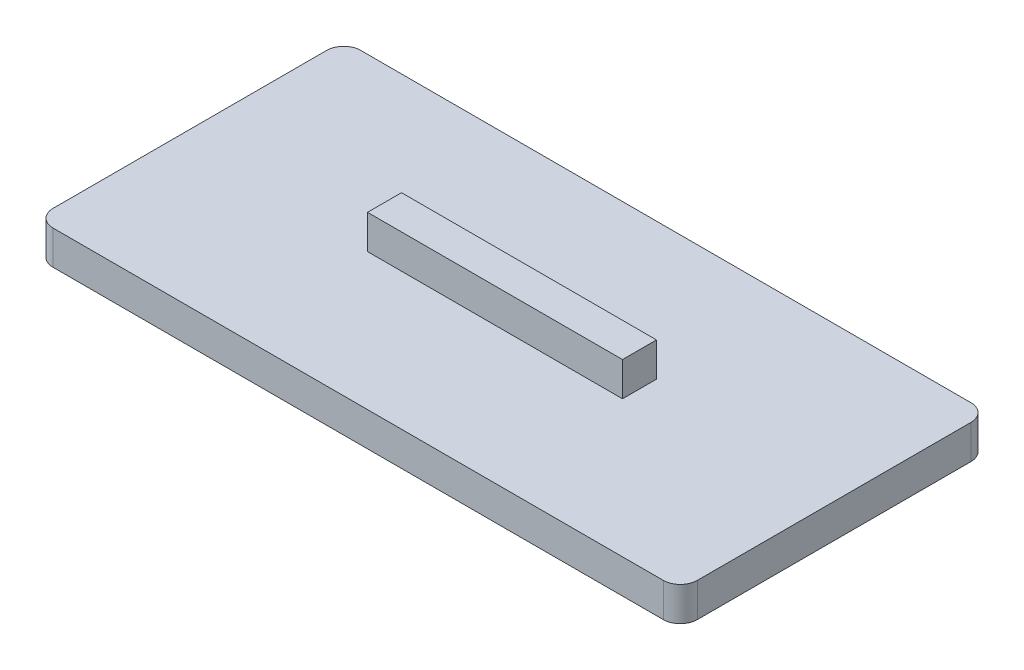
ISO-10303-21;
HEADER;
FILE_DESCRIPTION(('STEP AP214'),'2;1');
FILE_NAME('part.step','',(''),(''),'','','');
FILE_SCHEMA(('AUTOMOTIVE_DESIGN { 1 0 10303 214 1 1 1 1 }'));
ENDSEC;
DATA;
#1=APPLICATION_CONTEXT('core data for automotive mechanical design processes');
#2=APPLICATION_PROTOCOL_DEFINITION('international standard','automotive_design',2000,#1);
#3=PRODUCT_CONTEXT('',#1,'mechanical');
#4=PRODUCT('Part','Part','',(#3));
#5=PRODUCT_RELATED_PRODUCT_CATEGORY('part','',(#4));
#6=PRODUCT_DEFINITION_FORMATION('','',#4);
#7=PRODUCT_DEFINITION_CONTEXT('part definition',#1,'design');
#8=PRODUCT_DEFINITION('design','',#6,#7);
#9=PRODUCT_DEFINITION_SHAPE('','',#8);
#10=(LENGTH_UNIT() NAMED_UNIT(*) SI_UNIT(.MILLI.,.METRE.));
#11=(NAMED_UNIT(*) PLANE_ANGLE_UNIT() SI_UNIT($,.RADIAN.));
#12=(NAMED_UNIT(*) SI_UNIT($,.STERADIAN.) SOLID_ANGLE_UNIT());
#13=UNCERTAINTY_MEASURE_WITH_UNIT(LENGTH_MEASURE(1.E-05),#10,'distance_accuracy_value','');
#14=(GEOMETRIC_REPRESENTATION_CONTEXT(3) GLOBAL_UNCERTAINTY_ASSIGNED_CONTEXT((#13)) GLOBAL_UNIT_ASSIGNED_CONTEXT((#10,
#11,#12)) REPRESENTATION_CONTEXT('',''));
#15=CARTESIAN_POINT('',(0.,0.,0.));
#16=DIRECTION('',(0.,0.,1.));
#17=DIRECTION('',(1.,0.,0.));
#18=AXIS2_PLACEMENT_3D('',#15,#16,#17);
#19=CARTESIAN_POINT('',(-22.7965,0.,10.2235));
#20=DIRECTION('',(0.,-1.,0.));
#21=DIRECTION('',(0.,0.,-1.));
#22=AXIS2_PLACEMENT_3D('',#19,#20,#21);
#23=PLANE('',#22);
#24=CARTESIAN_POINT('',(-22.7965,0.,10.2235));
#25=DIRECTION('',(0.,1.,0.));
#26=DIRECTION('',(0.,0.,-1.));
#27=AXIS2_PLACEMENT_3D('',#24,#25,#26);
#28=CIRCLE('',#27,1.27);
#29=CARTESIAN_POINT('',(-24.0665,0.,10.2235));
#30=VERTEX_POINT('',#29);
#31=CARTESIAN_POINT('',(-22.7965,0.,11.4935));
#32=VERTEX_POINT('',#31);
#33=EDGE_CURVE('E162',#30,#32,#28,.T.);
#34=ORIENTED_EDGE('',*,*,#33,.T.);
#35=DIRECTION('',(1.,0.,0.));
#36=VECTOR('',#35,1.);
#37=CARTESIAN_POINT('',(-22.7965,0.,11.4935));
#38=LINE('',#37,#36);
#39=CARTESIAN_POINT('',(22.7965,0.,11.4935));
#40=VERTEX_POINT('',#39);
#41=EDGE_CURVE('E166',#32,#40,#38,.T.);
#42=ORIENTED_EDGE('',*,*,#41,.T.);
#43=CARTESIAN_POINT('',(22.7965,0.,10.2235));
#44=DIRECTION('',(0.,1.,0.));
#45=DIRECTION('',(0.,0.,1.));
#46=AXIS2_PLACEMENT_3D('',#43,#44,#45);
#47=CIRCLE('',#46,1.27);
#48=CARTESIAN_POINT('',(24.0665,0.,10.2235));
#49=VERTEX_POINT('',#48);
#50=EDGE_CURVE('E170',#40,#49,#47,.T.);
#51=ORIENTED_EDGE('',*,*,#50,.T.);
#52=DIRECTION('',(0.,0.,-1.));
#53=VECTOR('',#52,1.);
#54=CARTESIAN_POINT('',(24.0665,0.,10.2235));
#55=LINE('',#54,#53);
#56=CARTESIAN_POINT('',(24.0665,0.,-10.2235));
#57=VERTEX_POINT('',#56);
#58=EDGE_CURVE('E174',#49,#57,#55,.T.);
#59=ORIENTED_EDGE('',*,*,#58,.T.);
#60=CARTESIAN_POINT('',(22.7965,0.,-10.2235));
#61=DIRECTION('',(0.,1.,0.));
#62=DIRECTION('',(0.,0.,-1.));
#63=AXIS2_PLACEMENT_3D('',#60,#61,#62);
#64=CIRCLE('',#63,1.27);
#65=CARTESIAN_POINT('',(22.7965,0.,-11.4935));
#66=VERTEX_POINT('',#65);
#67=EDGE_CURVE('E178',#57,#66,#64,.T.);
#68=ORIENTED_EDGE('',*,*,#67,.T.);
#69=DIRECTION('',(-1.,0.,0.));
#70=VECTOR('',#69,1.);
#71=CARTESIAN_POINT('',(-22.7965,0.,-11.4935));
#72=LINE('',#71,#70);
#73=CARTESIAN_POINT('',(-22.7965,0.,-11.4935));
#74=VERTEX_POINT('',#73);
#75=EDGE_CURVE('E182',#66,#74,#72,.T.);
#76=ORIENTED_EDGE('',*,*,#75,.T.);
#77=CARTESIAN_POINT('',(-22.7965,0.,-10.2235));
#78=DIRECTION('',(0.,1.,0.));
#79=DIRECTION('',(0.,0.,-1.));
#80=AXIS2_PLACEMENT_3D('',#77,#78,#79);
#81=CIRCLE('',#80,1.27);
#82=CARTESIAN_POINT('',(-24.0665,0.,-10.2235));
#83=VERTEX_POINT('',#82);
#84=EDGE_CURVE('E134',#74,#83,#81,.T.);
#85=ORIENTED_EDGE('',*,*,#84,.T.);
#86=DIRECTION('',(0.,0.,1.));
#87=VECTOR('',#86,1.);
#88=CARTESIAN_POINT('',(-24.0665,0.,10.2235));
#89=LINE('',#88,#87);
#90=EDGE_CURVE('E187',#83,#30,#89,.T.);
#91=ORIENTED_EDGE('',*,*,#90,.T.);
#92=EDGE_LOOP('',(#34,#42,#51,#59,#68,#76,#85,#91));
#93=FACE_BOUND('',#92,.T.);
#94=DIRECTION('',(1.,0.,0.));
#95=VECTOR('',#94,1.);
#96=CARTESIAN_POINT('',(9.525,0.,1.27));
#97=LINE('',#96,#95);
#98=CARTESIAN_POINT('',(-9.525,0.,1.27));
#99=VERTEX_POINT('',#98);
#100=CARTESIAN_POINT('',(9.525,0.,1.27));
#101=VERTEX_POINT('',#100);
#102=EDGE_CURVE('E248',#99,#101,#97,.T.);
#103=ORIENTED_EDGE('',*,*,#102,.F.);
#104=DIRECTION('',(0.,0.,-1.));
#105=VECTOR('',#104,1.);
#106=CARTESIAN_POINT('',(-9.525,0.,1.27));
#107=LINE('',#106,#105);
#108=CARTESIAN_POINT('',(-9.525,0.,-1.27));
#109=VERTEX_POINT('',#108);
#110=EDGE_CURVE('E389',#99,#109,#107,.T.);
#111=ORIENTED_EDGE('',*,*,#110,.T.);
#112=DIRECTION('',(1.,0.,0.));
#113=VECTOR('',#112,1.);
#114=CARTESIAN_POINT('',(9.525,0.,-1.27));
#115=LINE('',#114,#113);
#116=CARTESIAN_POINT('',(9.525,0.,-1.27));
#117=VERTEX_POINT('',#116);
#118=EDGE_CURVE('E263',#109,#117,#115,.T.);
#119=ORIENTED_EDGE('',*,*,#118,.T.);
#120=DIRECTION('',(0.,0.,-1.));
#121=VECTOR('',#120,1.);
#122=CARTESIAN_POINT('',(9.525,0.,1.27));
#123=LINE('',#122,#121);
#124=EDGE_CURVE('E63',#101,#117,#123,.T.);
#125=ORIENTED_EDGE('',*,*,#124,.F.);
#126=EDGE_LOOP('',(#103,#111,#119,#125));
#127=FACE_BOUND('',#126,.T.);
#128=ADVANCED_FACE('F45',(#93,#127),#23,.F.);
#129=CARTESIAN_POINT('',(-22.7965,-2.54,10.2235));
#130=DIRECTION('',(0.,1.,0.));
#131=DIRECTION('',(0.,0.,1.));
#132=AXIS2_PLACEMENT_3D('',#129,#130,#131);
#133=CYLINDRICAL_SURFACE('',#132,1.27);
#134=ORIENTED_EDGE('',*,*,#33,.F.);
#135=DIRECTION('',(0.,1.,0.));
#136=VECTOR('',#135,1.);
#137=CARTESIAN_POINT('',(-24.0665,-2.54,10.2235));
#138=LINE('',#137,#136);
#139=CARTESIAN_POINT('',(-24.0665,-2.54,10.2235));
#140=VERTEX_POINT('',#139);
#141=EDGE_CURVE('E11',#140,#30,#138,.T.);
#142=ORIENTED_EDGE('',*,*,#141,.F.);
#143=CARTESIAN_POINT('',(-22.7965,-2.54,10.2235));
#144=DIRECTION('',(0.,1.,0.));
#145=DIRECTION('',(0.,0.,-1.));
#146=AXIS2_PLACEMENT_3D('',#143,#144,#145);
#147=CIRCLE('',#146,1.27);
#148=CARTESIAN_POINT('',(-22.7965,-2.54,11.4935));
#149=VERTEX_POINT('',#148);
#150=EDGE_CURVE('E190',#140,#149,#147,.T.);
#151=ORIENTED_EDGE('',*,*,#150,.T.);
#152=DIRECTION('',(0.,1.,0.));
#153=VECTOR('',#152,1.);
#154=CARTESIAN_POINT('',(-22.7965,-2.54,11.4935));
#155=LINE('',#154,#153);
#156=EDGE_CURVE('E49',#149,#32,#155,.T.);
#157=ORIENTED_EDGE('',*,*,#156,.T.);
#158=EDGE_LOOP('',(#134,#142,#151,#157));
#159=FACE_BOUND('',#158,.T.);
#160=ADVANCED_FACE('F47',(#159),#133,.T.);
#161=CARTESIAN_POINT('',(-24.0665,-2.54,10.2235));
#162=DIRECTION('',(-1.,0.,0.));
#163=DIRECTION('',(0.,0.,1.));
#164=AXIS2_PLACEMENT_3D('',#161,#162,#163);
#165=PLANE('',#164);
#166=ORIENTED_EDGE('',*,*,#90,.F.);
#167=DIRECTION('',(0.,1.,0.));
#168=VECTOR('',#167,1.);
#169=CARTESIAN_POINT('',(-24.0665,-2.54,-10.2235));
#170=LINE('',#169,#168);
#171=CARTESIAN_POINT('',(-24.0665,-2.54,-10.2235));
#172=VERTEX_POINT('',#171);
#173=EDGE_CURVE('E55',#172,#83,#170,.T.);
#174=ORIENTED_EDGE('',*,*,#173,.F.);
#175=DIRECTION('',(0.,0.,1.));
#176=VECTOR('',#175,1.);
#177=CARTESIAN_POINT('',(-24.0665,-2.54,10.2235));
#178=LINE('',#177,#176);
#179=EDGE_CURVE('E148',#172,#140,#178,.T.);
#180=ORIENTED_EDGE('',*,*,#179,.T.);
#181=ORIENTED_EDGE('',*,*,#141,.T.);
#182=EDGE_LOOP('',(#166,#174,#180,#181));
#183=FACE_BOUND('',#182,.T.);
#184=ADVANCED_FACE('F208',(#183),#165,.T.);
#185=CARTESIAN_POINT('',(-22.7965,-2.54,-10.2235));
#186=DIRECTION('',(0.,1.,0.));
#187=DIRECTION('',(0.,0.,1.));
#188=AXIS2_PLACEMENT_3D('',#185,#186,#187);
#189=CYLINDRICAL_SURFACE('',#188,1.27);
#190=ORIENTED_EDGE('',*,*,#84,.F.);
#191=DIRECTION('',(0.,1.,0.));
#192=VECTOR('',#191,1.);
#193=CARTESIAN_POINT('',(-22.7965,-2.54,-11.4935));
#194=LINE('',#193,#192);
#195=CARTESIAN_POINT('',(-22.7965,-2.54,-11.4935));
#196=VERTEX_POINT('',#195);
#197=EDGE_CURVE('E128',#196,#74,#194,.T.);
#198=ORIENTED_EDGE('',*,*,#197,.F.);
#199=CARTESIAN_POINT('',(-22.7965,-2.54,-10.2235));
#200=DIRECTION('',(0.,1.,0.));
#201=DIRECTION('',(0.,0.,-1.));
#202=AXIS2_PLACEMENT_3D('',#199,#200,#201);
#203=CIRCLE('',#202,1.27);
#204=EDGE_CURVE('E131',#196,#172,#203,.T.);
#205=ORIENTED_EDGE('',*,*,#204,.T.);
#206=ORIENTED_EDGE('',*,*,#173,.T.);
#207=EDGE_LOOP('',(#190,#198,#205,#206));
#208=FACE_BOUND('',#207,.T.);
#209=ADVANCED_FACE('F130',(#208),#189,.T.);
#210=CARTESIAN_POINT('',(-22.7965,-2.54,-11.4935));
#211=DIRECTION('',(0.,0.,-1.));
#212=DIRECTION('',(-1.,0.,0.));
#213=AXIS2_PLACEMENT_3D('',#210,#211,#212);
#214=PLANE('',#213);
#215=ORIENTED_EDGE('',*,*,#75,.F.);
#216=DIRECTION('',(0.,1.,0.));
#217=VECTOR('',#216,1.);
#218=CARTESIAN_POINT('',(22.7965,-2.54,-11.4935));
#219=LINE('',#218,#217);
#220=CARTESIAN_POINT('',(22.7965,-2.54,-11.4935));
#221=VERTEX_POINT('',#220);
#222=EDGE_CURVE('E140',#221,#66,#219,.T.);
#223=ORIENTED_EDGE('',*,*,#222,.F.);
#224=DIRECTION('',(-1.,0.,0.));
#225=VECTOR('',#224,1.);
#226=CARTESIAN_POINT('',(-22.7965,-2.54,-11.4935));
#227=LINE('',#226,#225);
#228=EDGE_CURVE('E146',#221,#196,#227,.T.);
#229=ORIENTED_EDGE('',*,*,#228,.T.);
#230=ORIENTED_EDGE('',*,*,#197,.T.);
#231=EDGE_LOOP('',(#215,#223,#229,#230));
#232=FACE_BOUND('',#231,.T.);
#233=ADVANCED_FACE('F151',(#232),#214,.T.);
#234=CARTESIAN_POINT('',(22.7965,-2.54,-10.2235));
#235=DIRECTION('',(0.,1.,0.));
#236=DIRECTION('',(0.,0.,1.));
#237=AXIS2_PLACEMENT_3D('',#234,#235,#236);
#238=CYLINDRICAL_SURFACE('',#237,1.27);
#239=ORIENTED_EDGE('',*,*,#67,.F.);
#240=DIRECTION('',(0.,1.,0.));
#241=VECTOR('',#240,1.);
#242=CARTESIAN_POINT('',(24.0665,-2.54,-10.2235));
#243=LINE('',#242,#241);
#244=CARTESIAN_POINT('',(24.0665,-2.54,-10.2235));
#245=VERTEX_POINT('',#244);
#246=EDGE_CURVE('E196',#245,#57,#243,.T.);
#247=ORIENTED_EDGE('',*,*,#246,.F.);
#248=CARTESIAN_POINT('',(22.7965,-2.54,-10.2235));
#249=DIRECTION('',(0.,1.,0.));
#250=DIRECTION('',(0.,0.,-1.));
#251=AXIS2_PLACEMENT_3D('',#248,#249,#250);
#252=CIRCLE('',#251,1.27);
#253=EDGE_CURVE('E153',#245,#221,#252,.T.);
#254=ORIENTED_EDGE('',*,*,#253,.T.);
#255=ORIENTED_EDGE('',*,*,#222,.T.);
#256=EDGE_LOOP('',(#239,#247,#254,#255));
#257=FACE_BOUND('',#256,.T.);
#258=ADVANCED_FACE('F292',(#257),#238,.T.);
#259=CARTESIAN_POINT('',(24.0665,-2.54,10.2235));
#260=DIRECTION('',(1.,0.,0.));
#261=DIRECTION('',(0.,0.,-1.));
#262=AXIS2_PLACEMENT_3D('',#259,#260,#261);
#263=PLANE('',#262);
#264=ORIENTED_EDGE('',*,*,#58,.F.);
#265=DIRECTION('',(0.,1.,0.));
#266=VECTOR('',#265,1.);
#267=CARTESIAN_POINT('',(24.0665,-2.54,10.2235));
#268=LINE('',#267,#266);
#269=CARTESIAN_POINT('',(24.0665,-2.54,10.2235));
#270=VERTEX_POINT('',#269);
#271=EDGE_CURVE('E199',#270,#49,#268,.T.);
#272=ORIENTED_EDGE('',*,*,#271,.F.);
#273=DIRECTION('',(0.,0.,-1.));
#274=VECTOR('',#273,1.);
#275=CARTESIAN_POINT('',(24.0665,-2.54,10.2235));
#276=LINE('',#275,#274);
#277=EDGE_CURVE('E156',#270,#245,#276,.T.);
#278=ORIENTED_EDGE('',*,*,#277,.T.);
#279=ORIENTED_EDGE('',*,*,#246,.T.);
#280=EDGE_LOOP('',(#264,#272,#278,#279));
#281=FACE_BOUND('',#280,.T.);
#282=ADVANCED_FACE('F286',(#281),#263,.T.);
#283=CARTESIAN_POINT('',(22.7965,-2.54,10.2235));
#284=DIRECTION('',(0.,1.,0.));
#285=DIRECTION('',(0.,0.,1.));
#286=AXIS2_PLACEMENT_3D('',#283,#284,#285);
#287=CYLINDRICAL_SURFACE('',#286,1.27);
#288=ORIENTED_EDGE('',*,*,#50,.F.);
#289=DIRECTION('',(0.,1.,0.));
#290=VECTOR('',#289,1.);
#291=CARTESIAN_POINT('',(22.7965,-2.54,11.4935));
#292=LINE('',#291,#290);
#293=CARTESIAN_POINT('',(22.7965,-2.54,11.4935));
#294=VERTEX_POINT('',#293);
#295=EDGE_CURVE('E201',#294,#40,#292,.T.);
#296=ORIENTED_EDGE('',*,*,#295,.F.);
#297=CARTESIAN_POINT('',(22.7965,-2.54,10.2235));
#298=DIRECTION('',(0.,1.,0.));
#299=DIRECTION('',(0.,0.,1.));
#300=AXIS2_PLACEMENT_3D('',#297,#298,#299);
#301=CIRCLE('',#300,1.27);
#302=EDGE_CURVE('E278',#294,#270,#301,.T.);
#303=ORIENTED_EDGE('',*,*,#302,.T.);
#304=ORIENTED_EDGE('',*,*,#271,.T.);
#305=EDGE_LOOP('',(#288,#296,#303,#304));
#306=FACE_BOUND('',#305,.T.);
#307=ADVANCED_FACE('F290',(#306),#287,.T.);
#308=CARTESIAN_POINT('',(-22.7965,-2.54,11.4935));
#309=DIRECTION('',(0.,0.,1.));
#310=DIRECTION('',(1.,0.,0.));
#311=AXIS2_PLACEMENT_3D('',#308,#309,#310);
#312=PLANE('',#311);
#313=ORIENTED_EDGE('',*,*,#41,.F.);
#314=ORIENTED_EDGE('',*,*,#156,.F.);
#315=DIRECTION('',(1.,0.,0.));
#316=VECTOR('',#315,1.);
#317=CARTESIAN_POINT('',(-22.7965,-2.54,11.4935));
#318=LINE('',#317,#316);
#319=EDGE_CURVE('E275',#149,#294,#318,.T.);
#320=ORIENTED_EDGE('',*,*,#319,.T.);
#321=ORIENTED_EDGE('',*,*,#295,.T.);
#322=EDGE_LOOP('',(#313,#314,#320,#321));
#323=FACE_BOUND('',#322,.T.);
#324=ADVANCED_FACE('F205',(#323),#312,.T.);
#325=CARTESIAN_POINT('',(-22.7965,-2.54,10.2235));
#326=DIRECTION('',(0.,-1.,0.));
#327=DIRECTION('',(0.,0.,-1.));
#328=AXIS2_PLACEMENT_3D('',#325,#326,#327);
#329=PLANE('',#328);
#330=ORIENTED_EDGE('',*,*,#150,.F.);
#331=ORIENTED_EDGE('',*,*,#179,.F.);
#332=ORIENTED_EDGE('',*,*,#204,.F.);
#333=ORIENTED_EDGE('',*,*,#228,.F.);
#334=ORIENTED_EDGE('',*,*,#253,.F.);
#335=ORIENTED_EDGE('',*,*,#277,.F.);
#336=ORIENTED_EDGE('',*,*,#302,.F.);
#337=ORIENTED_EDGE('',*,*,#319,.F.);
#338=EDGE_LOOP('',(#330,#331,#332,#333,#334,#335,#336,#337));
#339=FACE_BOUND('',#338,.T.);
#340=ADVANCED_FACE('F144',(#339),#329,.T.);
#341=CARTESIAN_POINT('',(9.525,2.54,1.27));
#342=DIRECTION('',(-1.,0.,0.));
#343=DIRECTION('',(0.,-1.,0.));
#344=AXIS2_PLACEMENT_3D('',#341,#342,#343);
#345=PLANE('',#344);
#346=DIRECTION('',(0.,1.,0.));
#347=VECTOR('',#346,1.);
#348=CARTESIAN_POINT('',(9.525,2.54,-1.27));
#349=LINE('',#348,#347);
#350=CARTESIAN_POINT('',(9.525,2.54,-1.27));
#351=VERTEX_POINT('',#350);
#352=EDGE_CURVE('E399',#117,#351,#349,.T.);
#353=ORIENTED_EDGE('',*,*,#352,.T.);
#354=DIRECTION('',(0.,0.,-1.));
#355=VECTOR('',#354,1.);
#356=CARTESIAN_POINT('',(9.525,2.54,1.27));
#357=LINE('',#356,#355);
#358=CARTESIAN_POINT('',(9.525,2.54,1.27));
#359=VERTEX_POINT('',#358);
#360=EDGE_CURVE('E265',#359,#351,#357,.T.);
#361=ORIENTED_EDGE('',*,*,#360,.F.);
#362=DIRECTION('',(0.,1.,0.));
#363=VECTOR('',#362,1.);
#364=CARTESIAN_POINT('',(9.525,2.54,1.27));
#365=LINE('',#364,#363);
#366=EDGE_CURVE('E251',#101,#359,#365,.T.);
#367=ORIENTED_EDGE('',*,*,#366,.F.);
#368=ORIENTED_EDGE('',*,*,#124,.T.);
#369=EDGE_LOOP('',(#353,#361,#367,#368));
#370=FACE_BOUND('',#369,.T.);
#371=ADVANCED_FACE('F224',(#370),#345,.F.);
#372=CARTESIAN_POINT('',(-9.525,2.54,1.27));
#373=DIRECTION('',(0.,-1.,0.));
#374=DIRECTION('',(0.,0.,-1.));
#375=AXIS2_PLACEMENT_3D('',#372,#373,#374);
#376=PLANE('',#375);
#377=DIRECTION('',(-1.,0.,0.));
#378=VECTOR('',#377,1.);
#379=CARTESIAN_POINT('',(-9.525,2.54,-1.27));
#380=LINE('',#379,#378);
#381=CARTESIAN_POINT('',(-9.525,2.54,-1.27));
#382=VERTEX_POINT('',#381);
#383=EDGE_CURVE('E395',#351,#382,#380,.T.);
#384=ORIENTED_EDGE('',*,*,#383,.T.);
#385=DIRECTION('',(0.,0.,-1.));
#386=VECTOR('',#385,1.);
#387=CARTESIAN_POINT('',(-9.525,2.54,1.27));
#388=LINE('',#387,#386);
#389=CARTESIAN_POINT('',(-9.525,2.54,1.27));
#390=VERTEX_POINT('',#389);
#391=EDGE_CURVE('E269',#390,#382,#388,.T.);
#392=ORIENTED_EDGE('',*,*,#391,.F.);
#393=DIRECTION('',(-1.,0.,0.));
#394=VECTOR('',#393,1.);
#395=CARTESIAN_POINT('',(-9.525,2.54,1.27));
#396=LINE('',#395,#394);
#397=EDGE_CURVE('E406',#359,#390,#396,.T.);
#398=ORIENTED_EDGE('',*,*,#397,.F.);
#399=ORIENTED_EDGE('',*,*,#360,.T.);
#400=EDGE_LOOP('',(#384,#392,#398,#399));
#401=FACE_BOUND('',#400,.T.);
#402=ADVANCED_FACE('F226',(#401),#376,.F.);
#403=CARTESIAN_POINT('',(-9.525,0.,1.27));
#404=DIRECTION('',(1.,0.,0.));
#405=DIRECTION('',(0.,0.,-1.));
#406=AXIS2_PLACEMENT_3D('',#403,#404,#405);
#407=PLANE('',#406);
#408=DIRECTION('',(0.,-1.,0.));
#409=VECTOR('',#408,1.);
#410=CARTESIAN_POINT('',(-9.525,0.,-1.27));
#411=LINE('',#410,#409);
#412=EDGE_CURVE('E259',#382,#109,#411,.T.);
#413=ORIENTED_EDGE('',*,*,#412,.T.);
#414=ORIENTED_EDGE('',*,*,#110,.F.);
#415=DIRECTION('',(0.,-1.,0.));
#416=VECTOR('',#415,1.);
#417=CARTESIAN_POINT('',(-9.525,0.,1.27));
#418=LINE('',#417,#416);
#419=EDGE_CURVE('E254',#390,#99,#418,.T.);
#420=ORIENTED_EDGE('',*,*,#419,.F.);
#421=ORIENTED_EDGE('',*,*,#391,.T.);
#422=EDGE_LOOP('',(#413,#414,#420,#421));
#423=FACE_BOUND('',#422,.T.);
#424=ADVANCED_FACE('F229',(#423),#407,.F.);
#425=CARTESIAN_POINT('',(0.,0.,1.27));
#426=DIRECTION('',(0.,0.,-1.));
#427=DIRECTION('',(-1.,0.,0.));
#428=AXIS2_PLACEMENT_3D('',#425,#426,#427);
#429=PLANE('',#428);
#430=ORIENTED_EDGE('',*,*,#102,.T.);
#431=ORIENTED_EDGE('',*,*,#366,.T.);
#432=ORIENTED_EDGE('',*,*,#397,.T.);
#433=ORIENTED_EDGE('',*,*,#419,.T.);
#434=EDGE_LOOP('',(#430,#431,#432,#433));
#435=FACE_BOUND('',#434,.T.);
#436=ADVANCED_FACE('F233',(#435),#429,.F.);
#437=CARTESIAN_POINT('',(0.,0.,-1.27));
#438=DIRECTION('',(0.,0.,-1.));
#439=DIRECTION('',(-1.,0.,0.));
#440=AXIS2_PLACEMENT_3D('',#437,#438,#439);
#441=PLANE('',#440);
#442=ORIENTED_EDGE('',*,*,#118,.F.);
#443=ORIENTED_EDGE('',*,*,#412,.F.);
#444=ORIENTED_EDGE('',*,*,#383,.F.);
#445=ORIENTED_EDGE('',*,*,#352,.F.);
#446=EDGE_LOOP('',(#442,#443,#444,#445));
#447=FACE_BOUND('',#446,.T.);
#448=ADVANCED_FACE('F235',(#447),#441,.T.);
#449=CLOSED_SHELL('',(#128,#160,#184,#209,#233,#258,#282,#307,#324,#340,#371,#402,#424,#436,#448));
#450=MANIFOLD_SOLID_BREP('B2',#449);
#451=ADVANCED_BREP_SHAPE_REPRESENTATION('',(#18,#450),#14);
#452=SHAPE_DEFINITION_REPRESENTATION(#9,#451);
ENDSEC;
END-ISO-10303-21;
